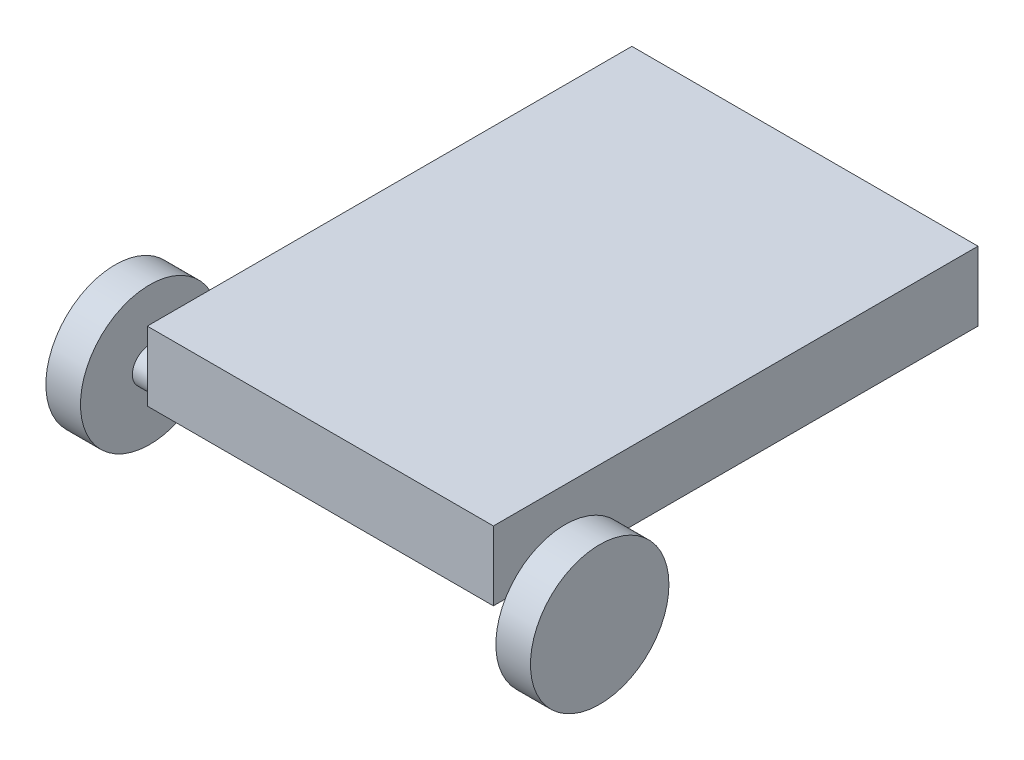
ISO-10303-21;
HEADER;
FILE_DESCRIPTION(('STEP AP214'),'2;1');
FILE_NAME('part.step','',(''),(''),'','','');
FILE_SCHEMA(('AUTOMOTIVE_DESIGN { 1 0 10303 214 1 1 1 1 }'));
ENDSEC;
DATA;
#1=APPLICATION_CONTEXT('core data for automotive mechanical design processes');
#2=APPLICATION_PROTOCOL_DEFINITION('international standard','automotive_design',2000,#1);
#3=PRODUCT_CONTEXT('',#1,'mechanical');
#4=PRODUCT('Part','Part','',(#3));
#5=PRODUCT_RELATED_PRODUCT_CATEGORY('part','',(#4));
#6=PRODUCT_DEFINITION_FORMATION('','',#4);
#7=PRODUCT_DEFINITION_CONTEXT('part definition',#1,'design');
#8=PRODUCT_DEFINITION('design','',#6,#7);
#9=PRODUCT_DEFINITION_SHAPE('','',#8);
#10=(LENGTH_UNIT() NAMED_UNIT(*) SI_UNIT(.MILLI.,.METRE.));
#11=(NAMED_UNIT(*) PLANE_ANGLE_UNIT() SI_UNIT($,.RADIAN.));
#12=(NAMED_UNIT(*) SI_UNIT($,.STERADIAN.) SOLID_ANGLE_UNIT());
#13=UNCERTAINTY_MEASURE_WITH_UNIT(LENGTH_MEASURE(1.E-05),#10,'distance_accuracy_value','');
#14=(GEOMETRIC_REPRESENTATION_CONTEXT(3) GLOBAL_UNCERTAINTY_ASSIGNED_CONTEXT((#13)) GLOBAL_UNIT_ASSIGNED_CONTEXT((#10,
#11,#12)) REPRESENTATION_CONTEXT('',''));
#15=CARTESIAN_POINT('',(0.,0.,0.));
#16=DIRECTION('',(0.,0.,1.));
#17=DIRECTION('',(1.,0.,0.));
#18=AXIS2_PLACEMENT_3D('',#15,#16,#17);
#19=CARTESIAN_POINT('',(0.,0.,0.));
#20=DIRECTION('',(0.,-1.,0.));
#21=DIRECTION('',(0.,0.,-1.));
#22=AXIS2_PLACEMENT_3D('',#19,#20,#21);
#23=PLANE('',#22);
#24=CARTESIAN_POINT('',(0.,0.,-30.));
#25=DIRECTION('',(0.,-1.,0.));
#26=DIRECTION('',(0.,0.,-1.));
#27=AXIS2_PLACEMENT_3D('',#24,#25,#26);
#28=CIRCLE('',#27,2.5);
#29=CARTESIAN_POINT('',(0.,0.,-32.5));
#30=VERTEX_POINT('',#29);
#31=EDGE_CURVE('E185',#30,#30,#28,.T.);
#32=ORIENTED_EDGE('',*,*,#31,.F.);
#33=EDGE_LOOP('',(#32));
#34=FACE_BOUND('',#33,.T.);
#35=DIRECTION('',(1.,0.,0.));
#36=VECTOR('',#35,1.);
#37=CARTESIAN_POINT('',(-30.,0.,27.1468092759178));
#38=LINE('',#37,#36);
#39=CARTESIAN_POINT('',(-25.,0.,27.1468092759178));
#40=VERTEX_POINT('',#39);
#41=CARTESIAN_POINT('',(25.,0.,27.1468092759178));
#42=VERTEX_POINT('',#41);
#43=EDGE_CURVE('E48',#40,#42,#38,.T.);
#44=ORIENTED_EDGE('',*,*,#43,.F.);
#45=DIRECTION('',(0.,0.,1.));
#46=VECTOR('',#45,1.);
#47=CARTESIAN_POINT('',(-25.,0.,35.));
#48=LINE('',#47,#46);
#49=CARTESIAN_POINT('',(-25.,0.,-35.));
#50=VERTEX_POINT('',#49);
#51=EDGE_CURVE('E97',#50,#40,#48,.T.);
#52=ORIENTED_EDGE('',*,*,#51,.F.);
#53=DIRECTION('',(-1.,0.,0.));
#54=VECTOR('',#53,1.);
#55=CARTESIAN_POINT('',(-25.,0.,-35.));
#56=LINE('',#55,#54);
#57=CARTESIAN_POINT('',(25.,0.,-35.));
#58=VERTEX_POINT('',#57);
#59=EDGE_CURVE('E98',#58,#50,#56,.T.);
#60=ORIENTED_EDGE('',*,*,#59,.F.);
#61=DIRECTION('',(0.,0.,-1.));
#62=VECTOR('',#61,1.);
#63=CARTESIAN_POINT('',(25.,0.,35.));
#64=LINE('',#63,#62);
#65=EDGE_CURVE('E206',#42,#58,#64,.T.);
#66=ORIENTED_EDGE('',*,*,#65,.F.);
#67=EDGE_LOOP('',(#44,#52,#60,#66));
#68=FACE_BOUND('',#67,.T.);
#69=ADVANCED_FACE('F33',(#34,#68),#23,.T.);
#70=CARTESIAN_POINT('',(25.,10.,35.));
#71=DIRECTION('',(-1.,0.,0.));
#72=DIRECTION('',(0.,0.,1.));
#73=AXIS2_PLACEMENT_3D('',#70,#71,#72);
#74=PLANE('',#73);
#75=CARTESIAN_POINT('',(25.,0.,35.));
#76=VERTEX_POINT('',#75);
#77=CARTESIAN_POINT('',(25.,0.,32.1468092759178));
#78=VERTEX_POINT('',#77);
#79=EDGE_CURVE('E216',#76,#78,#64,.T.);
#80=ORIENTED_EDGE('',*,*,#79,.T.);
#81=CARTESIAN_POINT('',(25.,0.,29.6468092759178));
#82=DIRECTION('',(-1.,0.,0.));
#83=DIRECTION('',(0.,0.,1.));
#84=AXIS2_PLACEMENT_3D('',#81,#82,#83);
#85=CIRCLE('',#84,2.5);
#86=EDGE_CURVE('E56',#78,#42,#85,.T.);
#87=ORIENTED_EDGE('',*,*,#86,.T.);
#88=ORIENTED_EDGE('',*,*,#65,.T.);
#89=DIRECTION('',(0.,-1.,0.));
#90=VECTOR('',#89,1.);
#91=CARTESIAN_POINT('',(25.,10.,-35.));
#92=LINE('',#91,#90);
#93=CARTESIAN_POINT('',(25.,10.,-35.));
#94=VERTEX_POINT('',#93);
#95=EDGE_CURVE('E109',#94,#58,#92,.T.);
#96=ORIENTED_EDGE('',*,*,#95,.F.);
#97=DIRECTION('',(0.,0.,-1.));
#98=VECTOR('',#97,1.);
#99=CARTESIAN_POINT('',(25.,10.,35.));
#100=LINE('',#99,#98);
#101=CARTESIAN_POINT('',(25.,10.,35.));
#102=VERTEX_POINT('',#101);
#103=EDGE_CURVE('E207',#102,#94,#100,.T.);
#104=ORIENTED_EDGE('',*,*,#103,.F.);
#105=DIRECTION('',(0.,-1.,0.));
#106=VECTOR('',#105,1.);
#107=CARTESIAN_POINT('',(25.,10.,35.));
#108=LINE('',#107,#106);
#109=EDGE_CURVE('E215',#102,#76,#108,.T.);
#110=ORIENTED_EDGE('',*,*,#109,.T.);
#111=EDGE_LOOP('',(#80,#87,#88,#96,#104,#110));
#112=FACE_BOUND('',#111,.T.);
#113=ADVANCED_FACE('F130',(#112),#74,.F.);
#114=CARTESIAN_POINT('',(-25.,10.,-35.));
#115=DIRECTION('',(0.,0.,1.));
#116=DIRECTION('',(1.,0.,0.));
#117=AXIS2_PLACEMENT_3D('',#114,#115,#116);
#118=PLANE('',#117);
#119=ORIENTED_EDGE('',*,*,#59,.T.);
#120=DIRECTION('',(0.,-1.,0.));
#121=VECTOR('',#120,1.);
#122=CARTESIAN_POINT('',(-25.,10.,-35.));
#123=LINE('',#122,#121);
#124=CARTESIAN_POINT('',(-25.,10.,-35.));
#125=VERTEX_POINT('',#124);
#126=EDGE_CURVE('E113',#125,#50,#123,.T.);
#127=ORIENTED_EDGE('',*,*,#126,.F.);
#128=DIRECTION('',(-1.,0.,0.));
#129=VECTOR('',#128,1.);
#130=CARTESIAN_POINT('',(-25.,10.,-35.));
#131=LINE('',#130,#129);
#132=EDGE_CURVE('E209',#94,#125,#131,.T.);
#133=ORIENTED_EDGE('',*,*,#132,.F.);
#134=ORIENTED_EDGE('',*,*,#95,.T.);
#135=EDGE_LOOP('',(#119,#127,#133,#134));
#136=FACE_BOUND('',#135,.T.);
#137=ADVANCED_FACE('F136',(#136),#118,.F.);
#138=CARTESIAN_POINT('',(-25.,10.,35.));
#139=DIRECTION('',(1.,0.,0.));
#140=DIRECTION('',(0.,0.,-1.));
#141=AXIS2_PLACEMENT_3D('',#138,#139,#140);
#142=PLANE('',#141);
#143=ORIENTED_EDGE('',*,*,#51,.T.);
#144=CARTESIAN_POINT('',(-25.,0.,29.6468092759178));
#145=DIRECTION('',(1.,0.,0.));
#146=DIRECTION('',(0.,0.,-1.));
#147=AXIS2_PLACEMENT_3D('',#144,#145,#146);
#148=CIRCLE('',#147,2.5);
#149=CARTESIAN_POINT('',(-25.,0.,32.1468092759178));
#150=VERTEX_POINT('',#149);
#151=EDGE_CURVE('E101',#40,#150,#148,.T.);
#152=ORIENTED_EDGE('',*,*,#151,.T.);
#153=CARTESIAN_POINT('',(-25.,0.,35.));
#154=VERTEX_POINT('',#153);
#155=EDGE_CURVE('E87',#150,#154,#48,.T.);
#156=ORIENTED_EDGE('',*,*,#155,.T.);
#157=DIRECTION('',(0.,-1.,0.));
#158=VECTOR('',#157,1.);
#159=CARTESIAN_POINT('',(-25.,10.,35.));
#160=LINE('',#159,#158);
#161=CARTESIAN_POINT('',(-25.,10.,35.));
#162=VERTEX_POINT('',#161);
#163=EDGE_CURVE('E222',#162,#154,#160,.T.);
#164=ORIENTED_EDGE('',*,*,#163,.F.);
#165=DIRECTION('',(0.,0.,1.));
#166=VECTOR('',#165,1.);
#167=CARTESIAN_POINT('',(-25.,10.,35.));
#168=LINE('',#167,#166);
#169=EDGE_CURVE('E211',#125,#162,#168,.T.);
#170=ORIENTED_EDGE('',*,*,#169,.F.);
#171=ORIENTED_EDGE('',*,*,#126,.T.);
#172=EDGE_LOOP('',(#143,#152,#156,#164,#170,#171));
#173=FACE_BOUND('',#172,.T.);
#174=ADVANCED_FACE('F102',(#173),#142,.F.);
#175=CARTESIAN_POINT('',(-25.,10.,35.));
#176=DIRECTION('',(0.,0.,-1.));
#177=DIRECTION('',(-1.,0.,0.));
#178=AXIS2_PLACEMENT_3D('',#175,#176,#177);
#179=PLANE('',#178);
#180=DIRECTION('',(1.,0.,0.));
#181=VECTOR('',#180,1.);
#182=CARTESIAN_POINT('',(-25.,0.,35.));
#183=LINE('',#182,#181);
#184=EDGE_CURVE('E93',#154,#76,#183,.T.);
#185=ORIENTED_EDGE('',*,*,#184,.T.);
#186=ORIENTED_EDGE('',*,*,#109,.F.);
#187=DIRECTION('',(1.,0.,0.));
#188=VECTOR('',#187,1.);
#189=CARTESIAN_POINT('',(-25.,10.,35.));
#190=LINE('',#189,#188);
#191=EDGE_CURVE('E213',#162,#102,#190,.T.);
#192=ORIENTED_EDGE('',*,*,#191,.F.);
#193=ORIENTED_EDGE('',*,*,#163,.T.);
#194=EDGE_LOOP('',(#185,#186,#192,#193));
#195=FACE_BOUND('',#194,.T.);
#196=ADVANCED_FACE('F148',(#195),#179,.F.);
#197=CARTESIAN_POINT('',(0.,10.,0.));
#198=DIRECTION('',(0.,-1.,0.));
#199=DIRECTION('',(0.,0.,-1.));
#200=AXIS2_PLACEMENT_3D('',#197,#198,#199);
#201=PLANE('',#200);
#202=ORIENTED_EDGE('',*,*,#103,.T.);
#203=ORIENTED_EDGE('',*,*,#132,.T.);
#204=ORIENTED_EDGE('',*,*,#169,.T.);
#205=ORIENTED_EDGE('',*,*,#191,.T.);
#206=EDGE_LOOP('',(#202,#203,#204,#205));
#207=FACE_BOUND('',#206,.T.);
#208=ADVANCED_FACE('F141',(#207),#201,.F.);
#209=DIRECTION('',(1.,0.,0.));
#210=VECTOR('',#209,1.);
#211=CARTESIAN_POINT('',(-30.,0.,32.1468092759178));
#212=LINE('',#211,#210);
#213=EDGE_CURVE('E92',#78,#150,#212,.F.);
#214=ORIENTED_EDGE('',*,*,#213,.F.);
#215=ORIENTED_EDGE('',*,*,#79,.F.);
#216=ORIENTED_EDGE('',*,*,#184,.F.);
#217=ORIENTED_EDGE('',*,*,#155,.F.);
#218=EDGE_LOOP('',(#214,#215,#216,#217));
#219=FACE_BOUND('',#218,.T.);
#220=ADVANCED_FACE('F89',(#219),#23,.T.);
#221=CARTESIAN_POINT('',(-30.,0.,29.6468092759178));
#222=DIRECTION('',(1.,0.,0.));
#223=DIRECTION('',(0.,0.,-1.));
#224=AXIS2_PLACEMENT_3D('',#221,#222,#223);
#225=CYLINDRICAL_SURFACE('',#224,2.5);
#226=ORIENTED_EDGE('',*,*,#151,.F.);
#227=ORIENTED_EDGE('',*,*,#43,.T.);
#228=ORIENTED_EDGE('',*,*,#86,.F.);
#229=ORIENTED_EDGE('',*,*,#213,.T.);
#230=EDGE_LOOP('',(#226,#227,#228,#229));
#231=FACE_BOUND('',#230,.T.);
#232=CARTESIAN_POINT('',(-30.,0.,29.6468092759178));
#233=DIRECTION('',(1.,0.,0.));
#234=DIRECTION('',(0.,0.,-1.));
#235=AXIS2_PLACEMENT_3D('',#232,#233,#234);
#236=CIRCLE('',#235,2.5);
#237=CARTESIAN_POINT('',(-30.,0.,27.1468092759178));
#238=VERTEX_POINT('',#237);
#239=EDGE_CURVE('E193',#238,#238,#236,.T.);
#240=ORIENTED_EDGE('',*,*,#239,.T.);
#241=EDGE_LOOP('',(#240));
#242=FACE_BOUND('',#241,.T.);
#243=CARTESIAN_POINT('',(30.,0.,29.6468092759178));
#244=DIRECTION('',(1.,0.,0.));
#245=DIRECTION('',(0.,0.,-1.));
#246=AXIS2_PLACEMENT_3D('',#243,#244,#245);
#247=CIRCLE('',#246,2.5);
#248=CARTESIAN_POINT('',(30.,0.,27.1468092759178));
#249=VERTEX_POINT('',#248);
#250=EDGE_CURVE('E105',#249,#249,#247,.T.);
#251=ORIENTED_EDGE('',*,*,#250,.F.);
#252=EDGE_LOOP('',(#251));
#253=FACE_BOUND('',#252,.T.);
#254=ADVANCED_FACE('F107',(#231,#242,#253),#225,.T.);
#255=CARTESIAN_POINT('',(35.,0.,29.6468092759178));
#256=DIRECTION('',(-1.,0.,0.));
#257=DIRECTION('',(0.,0.,1.));
#258=AXIS2_PLACEMENT_3D('',#255,#256,#257);
#259=CYLINDRICAL_SURFACE('',#258,10.);
#260=CARTESIAN_POINT('',(35.,0.,29.6468092759178));
#261=DIRECTION('',(1.,0.,0.));
#262=DIRECTION('',(0.,0.,-1.));
#263=AXIS2_PLACEMENT_3D('',#260,#261,#262);
#264=CIRCLE('',#263,10.);
#265=CARTESIAN_POINT('',(35.,0.,19.6468092759178));
#266=VERTEX_POINT('',#265);
#267=EDGE_CURVE('E195',#266,#266,#264,.T.);
#268=ORIENTED_EDGE('',*,*,#267,.F.);
#269=EDGE_LOOP('',(#268));
#270=FACE_BOUND('',#269,.T.);
#271=CARTESIAN_POINT('',(30.,0.,29.6468092759178));
#272=DIRECTION('',(1.,0.,0.));
#273=DIRECTION('',(0.,0.,-1.));
#274=AXIS2_PLACEMENT_3D('',#271,#272,#273);
#275=CIRCLE('',#274,10.);
#276=CARTESIAN_POINT('',(30.,0.,19.6468092759178));
#277=VERTEX_POINT('',#276);
#278=EDGE_CURVE('E198',#277,#277,#275,.T.);
#279=ORIENTED_EDGE('',*,*,#278,.T.);
#280=EDGE_LOOP('',(#279));
#281=FACE_BOUND('',#280,.T.);
#282=ADVANCED_FACE('F146',(#270,#281),#259,.T.);
#283=CARTESIAN_POINT('',(35.,0.,29.6468092759178));
#284=DIRECTION('',(1.,0.,0.));
#285=DIRECTION('',(0.,0.,-1.));
#286=AXIS2_PLACEMENT_3D('',#283,#284,#285);
#287=PLANE('',#286);
#288=ORIENTED_EDGE('',*,*,#267,.T.);
#289=EDGE_LOOP('',(#288));
#290=FACE_BOUND('',#289,.T.);
#291=ADVANCED_FACE('F158',(#290),#287,.T.);
#292=CARTESIAN_POINT('',(30.,0.,29.6468092759178));
#293=DIRECTION('',(1.,0.,0.));
#294=DIRECTION('',(0.,0.,-1.));
#295=AXIS2_PLACEMENT_3D('',#292,#293,#294);
#296=PLANE('',#295);
#297=ORIENTED_EDGE('',*,*,#250,.T.);
#298=EDGE_LOOP('',(#297));
#299=FACE_BOUND('',#298,.T.);
#300=ORIENTED_EDGE('',*,*,#278,.F.);
#301=EDGE_LOOP('',(#300));
#302=FACE_BOUND('',#301,.T.);
#303=ADVANCED_FACE('F160',(#299,#302),#296,.F.);
#304=CARTESIAN_POINT('',(-35.,0.,29.6468092759178));
#305=DIRECTION('',(1.,0.,0.));
#306=DIRECTION('',(0.,0.,-1.));
#307=AXIS2_PLACEMENT_3D('',#304,#305,#306);
#308=CYLINDRICAL_SURFACE('',#307,10.);
#309=CARTESIAN_POINT('',(-35.,0.,29.6468092759178));
#310=DIRECTION('',(1.,0.,0.));
#311=DIRECTION('',(0.,0.,-1.));
#312=AXIS2_PLACEMENT_3D('',#309,#310,#311);
#313=CIRCLE('',#312,10.);
#314=CARTESIAN_POINT('',(-35.,0.,19.6468092759178));
#315=VERTEX_POINT('',#314);
#316=EDGE_CURVE('E189',#315,#315,#313,.T.);
#317=ORIENTED_EDGE('',*,*,#316,.T.);
#318=EDGE_LOOP('',(#317));
#319=FACE_BOUND('',#318,.T.);
#320=CARTESIAN_POINT('',(-30.,0.,29.6468092759178));
#321=DIRECTION('',(1.,0.,0.));
#322=DIRECTION('',(0.,0.,-1.));
#323=AXIS2_PLACEMENT_3D('',#320,#321,#322);
#324=CIRCLE('',#323,10.);
#325=CARTESIAN_POINT('',(-30.,0.,19.6468092759178));
#326=VERTEX_POINT('',#325);
#327=EDGE_CURVE('E186',#326,#326,#324,.T.);
#328=ORIENTED_EDGE('',*,*,#327,.F.);
#329=EDGE_LOOP('',(#328));
#330=FACE_BOUND('',#329,.T.);
#331=ADVANCED_FACE('F163',(#319,#330),#308,.T.);
#332=CARTESIAN_POINT('',(-35.,0.,29.6468092759178));
#333=DIRECTION('',(-1.,0.,0.));
#334=DIRECTION('',(0.,0.,-1.));
#335=AXIS2_PLACEMENT_3D('',#332,#333,#334);
#336=PLANE('',#335);
#337=ORIENTED_EDGE('',*,*,#316,.F.);
#338=EDGE_LOOP('',(#337));
#339=FACE_BOUND('',#338,.T.);
#340=ADVANCED_FACE('F170',(#339),#336,.T.);
#341=CARTESIAN_POINT('',(-30.,0.,29.6468092759178));
#342=DIRECTION('',(-1.,0.,0.));
#343=DIRECTION('',(0.,0.,-1.));
#344=AXIS2_PLACEMENT_3D('',#341,#342,#343);
#345=PLANE('',#344);
#346=ORIENTED_EDGE('',*,*,#239,.F.);
#347=EDGE_LOOP('',(#346));
#348=FACE_BOUND('',#347,.T.);
#349=ORIENTED_EDGE('',*,*,#327,.T.);
#350=EDGE_LOOP('',(#349));
#351=FACE_BOUND('',#350,.T.);
#352=ADVANCED_FACE('F172',(#348,#351),#345,.F.);
#353=CARTESIAN_POINT('',(0.,-10.,-30.));
#354=DIRECTION('',(0.,1.,0.));
#355=DIRECTION('',(0.,0.,1.));
#356=AXIS2_PLACEMENT_3D('',#353,#354,#355);
#357=CYLINDRICAL_SURFACE('',#356,2.5);
#358=CARTESIAN_POINT('',(0.,-8.,-30.));
#359=DIRECTION('',(0.,-1.,0.));
#360=DIRECTION('',(0.,0.,-1.));
#361=AXIS2_PLACEMENT_3D('',#358,#359,#360);
#362=CIRCLE('',#361,2.5);
#363=CARTESIAN_POINT('',(0.,-8.,-32.5));
#364=VERTEX_POINT('',#363);
#365=EDGE_CURVE('E11',#364,#364,#362,.F.);
#366=ORIENTED_EDGE('',*,*,#365,.T.);
#367=EDGE_LOOP('',(#366));
#368=FACE_BOUND('',#367,.T.);
#369=ORIENTED_EDGE('',*,*,#31,.T.);
#370=EDGE_LOOP('',(#369));
#371=FACE_BOUND('',#370,.T.);
#372=ADVANCED_FACE('F126',(#368,#371),#357,.T.);
#373=CARTESIAN_POINT('',(0.,-10.,-30.));
#374=DIRECTION('',(0.,-1.,0.));
#375=DIRECTION('',(0.,0.,-1.));
#376=AXIS2_PLACEMENT_3D('',#373,#374,#375);
#377=PLANE('',#376);
#378=CARTESIAN_POINT('',(0.,-10.,-30.));
#379=DIRECTION('',(0.,-1.,0.));
#380=DIRECTION('',(0.,0.,-1.));
#381=AXIS2_PLACEMENT_3D('',#378,#379,#380);
#382=CIRCLE('',#381,0.5);
#383=CARTESIAN_POINT('',(0.,-10.,-30.5));
#384=VERTEX_POINT('',#383);
#385=EDGE_CURVE('E41',#384,#384,#382,.T.);
#386=ORIENTED_EDGE('',*,*,#385,.T.);
#387=EDGE_LOOP('',(#386));
#388=FACE_BOUND('',#387,.T.);
#389=ADVANCED_FACE('F119',(#388),#377,.T.);
#390=CARTESIAN_POINT('',(0.,-8.,-30.));
#391=DIRECTION('',(0.,-1.,0.));
#392=DIRECTION('',(0.,0.,-1.));
#393=AXIS2_PLACEMENT_3D('',#390,#391,#392);
#394=DEGENERATE_TOROIDAL_SURFACE('',#393,0.5,2.,.T.);
#395=ORIENTED_EDGE('',*,*,#365,.F.);
#396=EDGE_LOOP('',(#395));
#397=FACE_BOUND('',#396,.T.);
#398=ORIENTED_EDGE('',*,*,#385,.F.);
#399=EDGE_LOOP('',(#398));
#400=FACE_BOUND('',#399,.T.);
#401=ADVANCED_FACE('F35',(#397,#400),#394,.T.);
#402=CLOSED_SHELL('',(#69,#113,#137,#174,#196,#208,#220,#254,#282,#291,#303,#331,#340,#352,#372,
#389,#401));
#403=MANIFOLD_SOLID_BREP('B2',#402);
#404=ADVANCED_BREP_SHAPE_REPRESENTATION('',(#18,#403),#14);
#405=SHAPE_DEFINITION_REPRESENTATION(#9,#404);
ENDSEC;
END-ISO-10303-21;
